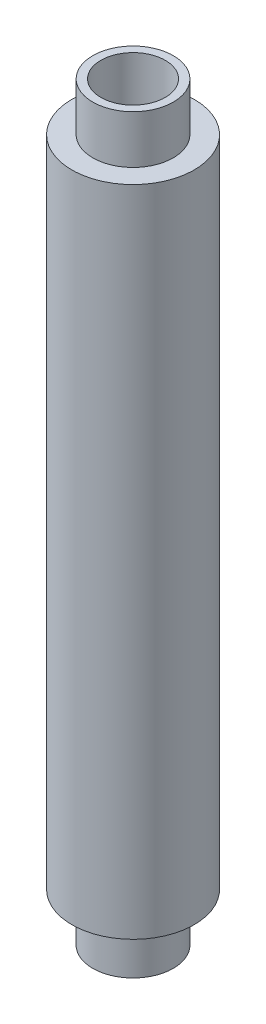
ISO-10303-21;
HEADER;
FILE_DESCRIPTION(('STEP AP214'),'2;1');
FILE_NAME('part.step','',(''),(''),'','','');
FILE_SCHEMA(('AUTOMOTIVE_DESIGN { 1 0 10303 214 1 1 1 1 }'));
ENDSEC;
DATA;
#1=APPLICATION_CONTEXT('core data for automotive mechanical design processes');
#2=APPLICATION_PROTOCOL_DEFINITION('international standard','automotive_design',2000,#1);
#3=PRODUCT_CONTEXT('',#1,'mechanical');
#4=PRODUCT('Part','Part','',(#3));
#5=PRODUCT_RELATED_PRODUCT_CATEGORY('part','',(#4));
#6=PRODUCT_DEFINITION_FORMATION('','',#4);
#7=PRODUCT_DEFINITION_CONTEXT('part definition',#1,'design');
#8=PRODUCT_DEFINITION('design','',#6,#7);
#9=PRODUCT_DEFINITION_SHAPE('','',#8);
#10=(LENGTH_UNIT() NAMED_UNIT(*) SI_UNIT(.MILLI.,.METRE.));
#11=(NAMED_UNIT(*) PLANE_ANGLE_UNIT() SI_UNIT($,.RADIAN.));
#12=(NAMED_UNIT(*) SI_UNIT($,.STERADIAN.) SOLID_ANGLE_UNIT());
#13=UNCERTAINTY_MEASURE_WITH_UNIT(LENGTH_MEASURE(1.E-05),#10,'distance_accuracy_value','');
#14=(GEOMETRIC_REPRESENTATION_CONTEXT(3) GLOBAL_UNCERTAINTY_ASSIGNED_CONTEXT((#13)) GLOBAL_UNIT_ASSIGNED_CONTEXT((#10,
#11,#12)) REPRESENTATION_CONTEXT('',''));
#15=CARTESIAN_POINT('',(0.,0.,0.));
#16=DIRECTION('',(0.,0.,1.));
#17=DIRECTION('',(1.,0.,0.));
#18=AXIS2_PLACEMENT_3D('',#15,#16,#17);
#19=CARTESIAN_POINT('',(0.,203.,0.));
#20=DIRECTION('',(0.,-1.,0.));
#21=DIRECTION('',(0.,0.,-1.));
#22=AXIS2_PLACEMENT_3D('',#19,#20,#21);
#23=CYLINDRICAL_SURFACE('',#22,19.);
#24=CARTESIAN_POINT('',(0.,203.,0.));
#25=DIRECTION('',(0.,1.,0.));
#26=DIRECTION('',(0.,0.,1.));
#27=AXIS2_PLACEMENT_3D('',#24,#25,#26);
#28=CIRCLE('',#27,19.);
#29=CARTESIAN_POINT('',(0.,203.,-19.));
#30=VERTEX_POINT('',#29);
#31=EDGE_CURVE('E59',#30,#30,#28,.T.);
#32=CARTESIAN_POINT('',(0.,0.,0.));
#33=DIRECTION('',(0.,1.,0.));
#34=DIRECTION('',(0.,0.,1.));
#35=AXIS2_PLACEMENT_3D('',#32,#33,#34);
#36=CIRCLE('',#35,19.);
#37=CARTESIAN_POINT('',(0.,0.,-19.));
#38=VERTEX_POINT('',#37);
#39=EDGE_CURVE('E64',#38,#38,#36,.T.);
#40=CARTESIAN_POINT('',(0.,203.,-19.));
#41=CARTESIAN_POINT('',(0.,200.885416666667,-19.));
#42=CARTESIAN_POINT('',(0.,198.770833333333,-19.));
#43=CARTESIAN_POINT('',(0.,194.541666666667,-19.));
#44=CARTESIAN_POINT('',(0.,192.427083333333,-19.));
#45=CARTESIAN_POINT('',(0.,188.197916666667,-19.));
#46=CARTESIAN_POINT('',(0.,186.083333333333,-19.));
#47=CARTESIAN_POINT('',(0.,181.854166666667,-19.));
#48=CARTESIAN_POINT('',(0.,179.739583333333,-19.));
#49=CARTESIAN_POINT('',(0.,175.510416666667,-19.));
#50=CARTESIAN_POINT('',(0.,173.395833333333,-19.));
#51=CARTESIAN_POINT('',(0.,169.166666666667,-19.));
#52=CARTESIAN_POINT('',(0.,167.052083333333,-19.));
#53=CARTESIAN_POINT('',(0.,162.822916666667,-19.));
#54=CARTESIAN_POINT('',(0.,160.708333333333,-19.));
#55=CARTESIAN_POINT('',(0.,156.479166666667,-19.));
#56=CARTESIAN_POINT('',(0.,154.364583333333,-19.));
#57=CARTESIAN_POINT('',(0.,150.135416666667,-19.));
#58=CARTESIAN_POINT('',(0.,148.020833333333,-19.));
#59=CARTESIAN_POINT('',(0.,143.791666666667,-19.));
#60=CARTESIAN_POINT('',(0.,141.677083333333,-19.));
#61=CARTESIAN_POINT('',(0.,137.447916666667,-19.));
#62=CARTESIAN_POINT('',(0.,135.333333333333,-19.));
#63=CARTESIAN_POINT('',(0.,131.104166666667,-19.));
#64=CARTESIAN_POINT('',(0.,128.989583333333,-19.));
#65=CARTESIAN_POINT('',(0.,124.760416666667,-19.));
#66=CARTESIAN_POINT('',(0.,122.645833333333,-19.));
#67=CARTESIAN_POINT('',(0.,118.416666666667,-19.));
#68=CARTESIAN_POINT('',(0.,116.302083333333,-19.));
#69=CARTESIAN_POINT('',(0.,112.072916666667,-19.));
#70=CARTESIAN_POINT('',(0.,109.958333333333,-19.));
#71=CARTESIAN_POINT('',(0.,105.729166666667,-19.));
#72=CARTESIAN_POINT('',(0.,103.614583333333,-19.));
#73=CARTESIAN_POINT('',(0.,99.3854166666667,-19.));
#74=CARTESIAN_POINT('',(0.,97.2708333333333,-19.));
#75=CARTESIAN_POINT('',(0.,93.0416666666667,-19.));
#76=CARTESIAN_POINT('',(0.,90.9270833333333,-19.));
#77=CARTESIAN_POINT('',(0.,86.6979166666667,-19.));
#78=CARTESIAN_POINT('',(0.,84.5833333333333,-19.));
#79=CARTESIAN_POINT('',(0.,80.3541666666667,-19.));
#80=CARTESIAN_POINT('',(0.,78.2395833333333,-19.));
#81=CARTESIAN_POINT('',(0.,74.0104166666667,-19.));
#82=CARTESIAN_POINT('',(0.,71.8958333333333,-19.));
#83=CARTESIAN_POINT('',(0.,67.6666666666667,-19.));
#84=CARTESIAN_POINT('',(0.,65.5520833333333,-19.));
#85=CARTESIAN_POINT('',(0.,61.3229166666666,-19.));
#86=CARTESIAN_POINT('',(0.,59.2083333333333,-19.));
#87=CARTESIAN_POINT('',(0.,54.9791666666666,-19.));
#88=CARTESIAN_POINT('',(0.,52.8645833333333,-19.));
#89=CARTESIAN_POINT('',(0.,48.6354166666667,-19.));
#90=CARTESIAN_POINT('',(0.,46.5208333333333,-19.));
#91=CARTESIAN_POINT('',(0.,42.2916666666666,-19.));
#92=CARTESIAN_POINT('',(0.,40.1770833333333,-19.));
#93=CARTESIAN_POINT('',(0.,35.9479166666666,-19.));
#94=CARTESIAN_POINT('',(0.,33.8333333333333,-19.));
#95=CARTESIAN_POINT('',(0.,29.6041666666667,-19.));
#96=CARTESIAN_POINT('',(0.,27.4895833333333,-19.));
#97=CARTESIAN_POINT('',(0.,23.2604166666666,-19.));
#98=CARTESIAN_POINT('',(0.,21.1458333333333,-19.));
#99=CARTESIAN_POINT('',(0.,16.9166666666666,-19.));
#100=CARTESIAN_POINT('',(0.,14.8020833333333,-19.));
#101=CARTESIAN_POINT('',(0.,10.5729166666666,-19.));
#102=CARTESIAN_POINT('',(0.,8.45833333333331,-19.));
#103=CARTESIAN_POINT('',(0.,4.22916666666664,-19.));
#104=CARTESIAN_POINT('',(0.,2.11458333333331,-19.));
#105=CARTESIAN_POINT('',(0.,0.,-19.));
#106=B_SPLINE_CURVE_WITH_KNOTS('',3,(#40,#41,#42,#43,#44,#45,#46,#47,#48,#49,#50,#51,#52,#53,
#54,#55,#56,#57,#58,#59,#60,#61,#62,#63,#64,#65,#66,#67,#68,#69,#70,#71,#72,#73,#74,#75,#76,#77,
#78,#79,#80,#81,#82,#83,#84,#85,#86,#87,#88,#89,#90,#91,#92,#93,#94,#95,#96,#97,#98,#99,#100,
#101,#102,#103,#104,#105),.UNSPECIFIED.,.F.,.F.,(4,2,2,2,2,2,2,2,2,2,2,2,2,2,2,2,2,2,2,2,2,2,2,
2,2,2,2,2,2,2,2,2,4),(0.,6.34374999999998,12.6875,19.03125,25.375,31.71875,38.0625,44.40625,
50.75,57.09375,63.4375,69.78125,76.125,82.46875,88.8125,95.15625,101.5,107.84375,114.1875,
120.53125,126.875,133.21875,139.5625,145.90625,152.25,158.59375,164.9375,171.28125,177.625,
183.96875,190.3125,196.65625,203.),.UNSPECIFIED.);
#107=EDGE_CURVE('BSEAM47',#30,#38,#106,.T.);
#108=ORIENTED_EDGE('',*,*,#31,.F.);
#109=ORIENTED_EDGE('',*,*,#39,.T.);
#110=ORIENTED_EDGE('',*,*,#107,.T.);
#111=ORIENTED_EDGE('',*,*,#107,.F.);
#112=EDGE_LOOP('',(#108,#110,#109,#111));
#113=FACE_BOUND('',#112,.T.);
#114=ADVANCED_FACE('F47',(#113),#23,.T.);
#115=CARTESIAN_POINT('',(0.,203.,0.));
#116=DIRECTION('',(0.,1.,0.));
#117=DIRECTION('',(0.,0.,1.));
#118=AXIS2_PLACEMENT_3D('',#115,#116,#117);
#119=PLANE('',#118);
#120=CARTESIAN_POINT('',(0.,203.,0.));
#121=DIRECTION('',(0.,1.,0.));
#122=DIRECTION('',(0.,0.,1.));
#123=AXIS2_PLACEMENT_3D('',#120,#121,#122);
#124=CIRCLE('',#123,12.5);
#125=CARTESIAN_POINT('',(0.,203.,12.5));
#126=VERTEX_POINT('',#125);
#127=EDGE_CURVE('E83',#126,#126,#124,.T.);
#128=ORIENTED_EDGE('',*,*,#127,.F.);
#129=EDGE_LOOP('',(#128));
#130=FACE_BOUND('',#129,.T.);
#131=ORIENTED_EDGE('',*,*,#31,.T.);
#132=EDGE_LOOP('',(#131));
#133=FACE_BOUND('',#132,.T.);
#134=ADVANCED_FACE('F114',(#130,#133),#119,.T.);
#135=CARTESIAN_POINT('',(0.,0.,0.));
#136=DIRECTION('',(0.,1.,0.));
#137=DIRECTION('',(0.,0.,1.));
#138=AXIS2_PLACEMENT_3D('',#135,#136,#137);
#139=PLANE('',#138);
#140=CARTESIAN_POINT('',(0.,0.,0.));
#141=DIRECTION('',(0.,1.,0.));
#142=DIRECTION('',(0.,0.,1.));
#143=AXIS2_PLACEMENT_3D('',#140,#141,#142);
#144=CIRCLE('',#143,12.5);
#145=CARTESIAN_POINT('',(0.,0.,12.5));
#146=VERTEX_POINT('',#145);
#147=EDGE_CURVE('E54',#146,#146,#144,.F.);
#148=ORIENTED_EDGE('',*,*,#147,.F.);
#149=EDGE_LOOP('',(#148));
#150=FACE_BOUND('',#149,.T.);
#151=ORIENTED_EDGE('',*,*,#39,.F.);
#152=EDGE_LOOP('',(#151));
#153=FACE_BOUND('',#152,.T.);
#154=ADVANCED_FACE('F111',(#150,#153),#139,.F.);
#155=CARTESIAN_POINT('',(0.,-15.,0.));
#156=DIRECTION('',(0.,-1.,0.));
#157=DIRECTION('',(0.,0.,-1.));
#158=AXIS2_PLACEMENT_3D('',#155,#156,#157);
#159=PLANE('',#158);
#160=CARTESIAN_POINT('',(0.,-15.,0.));
#161=DIRECTION('',(0.,-1.,0.));
#162=DIRECTION('',(0.,0.,-1.));
#163=AXIS2_PLACEMENT_3D('',#160,#161,#162);
#164=CIRCLE('',#163,12.5);
#165=CARTESIAN_POINT('',(0.,-15.,-12.5));
#166=VERTEX_POINT('',#165);
#167=EDGE_CURVE('E69',#166,#166,#164,.T.);
#168=ORIENTED_EDGE('',*,*,#167,.T.);
#169=EDGE_LOOP('',(#168));
#170=FACE_BOUND('',#169,.T.);
#171=CARTESIAN_POINT('',(0.,-15.,0.));
#172=DIRECTION('',(0.,-1.,0.));
#173=DIRECTION('',(0.,0.,-1.));
#174=AXIS2_PLACEMENT_3D('',#171,#172,#173);
#175=CIRCLE('',#174,10.);
#176=CARTESIAN_POINT('',(0.,-15.,-10.));
#177=VERTEX_POINT('',#176);
#178=EDGE_CURVE('E74',#177,#177,#175,.T.);
#179=ORIENTED_EDGE('',*,*,#178,.F.);
#180=EDGE_LOOP('',(#179));
#181=FACE_BOUND('',#180,.T.);
#182=ADVANCED_FACE('F127',(#170,#181),#159,.T.);
#183=CARTESIAN_POINT('',(0.,-15.,0.));
#184=DIRECTION('',(0.,1.,0.));
#185=DIRECTION('',(0.,0.,1.));
#186=AXIS2_PLACEMENT_3D('',#183,#184,#185);
#187=CYLINDRICAL_SURFACE('',#186,12.5);
#188=ORIENTED_EDGE('',*,*,#167,.F.);
#189=EDGE_LOOP('',(#188));
#190=FACE_BOUND('',#189,.T.);
#191=ORIENTED_EDGE('',*,*,#147,.T.);
#192=EDGE_LOOP('',(#191));
#193=FACE_BOUND('',#192,.T.);
#194=ADVANCED_FACE('F132',(#190,#193),#187,.T.);
#195=CARTESIAN_POINT('',(0.,-15.,0.));
#196=DIRECTION('',(0.,1.,0.));
#197=DIRECTION('',(0.,0.,1.));
#198=AXIS2_PLACEMENT_3D('',#195,#196,#197);
#199=CYLINDRICAL_SURFACE('',#198,10.);
#200=ORIENTED_EDGE('',*,*,#178,.T.);
#201=EDGE_LOOP('',(#200));
#202=FACE_BOUND('',#201,.T.);
#203=CARTESIAN_POINT('',(0.,0.,0.));
#204=DIRECTION('',(0.,-1.,0.));
#205=DIRECTION('',(0.,0.,-1.));
#206=AXIS2_PLACEMENT_3D('',#203,#204,#205);
#207=CIRCLE('',#206,10.);
#208=CARTESIAN_POINT('',(0.,0.,-10.));
#209=VERTEX_POINT('',#208);
#210=EDGE_CURVE('E75',#209,#209,#207,.T.);
#211=ORIENTED_EDGE('',*,*,#210,.F.);
#212=EDGE_LOOP('',(#211));
#213=FACE_BOUND('',#212,.T.);
#214=ADVANCED_FACE('F109',(#202,#213),#199,.F.);
#215=ORIENTED_EDGE('',*,*,#210,.T.);
#216=EDGE_LOOP('',(#215));
#217=FACE_BOUND('',#216,.T.);
#218=ADVANCED_FACE('F100',(#217),#139,.F.);
#219=CARTESIAN_POINT('',(0.,218.,0.));
#220=DIRECTION('',(0.,1.,0.));
#221=DIRECTION('',(0.,0.,1.));
#222=AXIS2_PLACEMENT_3D('',#219,#220,#221);
#223=PLANE('',#222);
#224=CARTESIAN_POINT('',(0.,218.,0.));
#225=DIRECTION('',(0.,1.,0.));
#226=DIRECTION('',(0.,0.,1.));
#227=AXIS2_PLACEMENT_3D('',#224,#225,#226);
#228=CIRCLE('',#227,12.5);
#229=CARTESIAN_POINT('',(0.,218.,12.5));
#230=VERTEX_POINT('',#229);
#231=EDGE_CURVE('E79',#230,#230,#228,.T.);
#232=ORIENTED_EDGE('',*,*,#231,.T.);
#233=EDGE_LOOP('',(#232));
#234=FACE_BOUND('',#233,.T.);
#235=CARTESIAN_POINT('',(0.,218.,0.));
#236=DIRECTION('',(0.,1.,0.));
#237=DIRECTION('',(0.,0.,1.));
#238=AXIS2_PLACEMENT_3D('',#235,#236,#237);
#239=CIRCLE('',#238,10.);
#240=CARTESIAN_POINT('',(0.,218.,10.));
#241=VERTEX_POINT('',#240);
#242=EDGE_CURVE('E87',#241,#241,#239,.T.);
#243=ORIENTED_EDGE('',*,*,#242,.F.);
#244=EDGE_LOOP('',(#243));
#245=FACE_BOUND('',#244,.T.);
#246=ADVANCED_FACE('F97',(#234,#245),#223,.T.);
#247=CARTESIAN_POINT('',(0.,218.,0.));
#248=DIRECTION('',(0.,-1.,0.));
#249=DIRECTION('',(0.,0.,-1.));
#250=AXIS2_PLACEMENT_3D('',#247,#248,#249);
#251=CYLINDRICAL_SURFACE('',#250,12.5);
#252=ORIENTED_EDGE('',*,*,#231,.F.);
#253=EDGE_LOOP('',(#252));
#254=FACE_BOUND('',#253,.T.);
#255=ORIENTED_EDGE('',*,*,#127,.T.);
#256=EDGE_LOOP('',(#255));
#257=FACE_BOUND('',#256,.T.);
#258=ADVANCED_FACE('F99',(#254,#257),#251,.T.);
#259=CARTESIAN_POINT('',(0.,218.,0.));
#260=DIRECTION('',(0.,-1.,0.));
#261=DIRECTION('',(0.,0.,-1.));
#262=AXIS2_PLACEMENT_3D('',#259,#260,#261);
#263=CYLINDRICAL_SURFACE('',#262,10.);
#264=ORIENTED_EDGE('',*,*,#242,.T.);
#265=EDGE_LOOP('',(#264));
#266=FACE_BOUND('',#265,.T.);
#267=CARTESIAN_POINT('',(0.,203.,0.));
#268=DIRECTION('',(0.,1.,0.));
#269=DIRECTION('',(0.,0.,1.));
#270=AXIS2_PLACEMENT_3D('',#267,#268,#269);
#271=CIRCLE('',#270,10.);
#272=CARTESIAN_POINT('',(0.,203.,10.));
#273=VERTEX_POINT('',#272);
#274=EDGE_CURVE('E10',#273,#273,#271,.F.);
#275=ORIENTED_EDGE('',*,*,#274,.T.);
#276=EDGE_LOOP('',(#275));
#277=FACE_BOUND('',#276,.T.);
#278=ADVANCED_FACE('F95',(#266,#277),#263,.F.);
#279=ORIENTED_EDGE('',*,*,#274,.F.);
#280=EDGE_LOOP('',(#279));
#281=FACE_BOUND('',#280,.T.);
#282=ADVANCED_FACE('F121',(#281),#119,.T.);
#283=CLOSED_SHELL('',(#114,#134,#154,#182,#194,#214,#218,#246,#258,#278,#282));
#284=MANIFOLD_SOLID_BREP('B2',#283);
#285=ADVANCED_BREP_SHAPE_REPRESENTATION('',(#18,#284),#14);
#286=SHAPE_DEFINITION_REPRESENTATION(#9,#285);
ENDSEC;
END-ISO-10303-21;
